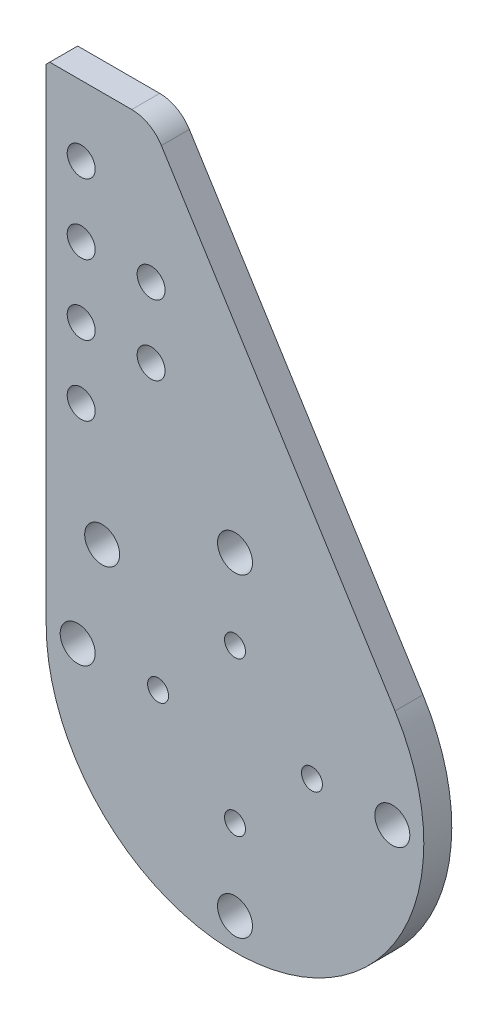
ISO-10303-21;
HEADER;
FILE_DESCRIPTION(('STEP AP214'),'2;1');
FILE_NAME('part.step','',(''),(''),'','','');
FILE_SCHEMA(('AUTOMOTIVE_DESIGN { 1 0 10303 214 1 1 1 1 }'));
ENDSEC;
DATA;
#1=APPLICATION_CONTEXT('core data for automotive mechanical design processes');
#2=APPLICATION_PROTOCOL_DEFINITION('international standard','automotive_design',2000,#1);
#3=PRODUCT_CONTEXT('',#1,'mechanical');
#4=PRODUCT('Part','Part','',(#3));
#5=PRODUCT_RELATED_PRODUCT_CATEGORY('part','',(#4));
#6=PRODUCT_DEFINITION_FORMATION('','',#4);
#7=PRODUCT_DEFINITION_CONTEXT('part definition',#1,'design');
#8=PRODUCT_DEFINITION('design','',#6,#7);
#9=PRODUCT_DEFINITION_SHAPE('','',#8);
#10=(LENGTH_UNIT() NAMED_UNIT(*) SI_UNIT(.MILLI.,.METRE.));
#11=(NAMED_UNIT(*) PLANE_ANGLE_UNIT() SI_UNIT($,.RADIAN.));
#12=(NAMED_UNIT(*) SI_UNIT($,.STERADIAN.) SOLID_ANGLE_UNIT());
#13=UNCERTAINTY_MEASURE_WITH_UNIT(LENGTH_MEASURE(1.E-05),#10,'distance_accuracy_value','');
#14=(GEOMETRIC_REPRESENTATION_CONTEXT(3) GLOBAL_UNCERTAINTY_ASSIGNED_CONTEXT((#13)) GLOBAL_UNIT_ASSIGNED_CONTEXT((#10,
#11,#12)) REPRESENTATION_CONTEXT('',''));
#15=CARTESIAN_POINT('',(0.,0.,0.));
#16=DIRECTION('',(0.,0.,1.));
#17=DIRECTION('',(1.,0.,0.));
#18=AXIS2_PLACEMENT_3D('',#15,#16,#17);
#19=CARTESIAN_POINT('',(0.,0.,4.));
#20=DIRECTION('',(0.,0.,1.));
#21=DIRECTION('',(1.,0.,0.));
#22=AXIS2_PLACEMENT_3D('',#19,#20,#21);
#23=PLANE('',#22);
#24=CARTESIAN_POINT('',(0.,-11.,4.));
#25=DIRECTION('',(0.,0.,1.));
#26=DIRECTION('',(1.,0.,0.));
#27=AXIS2_PLACEMENT_3D('',#24,#25,#26);
#28=CIRCLE('',#27,1.5);
#29=CARTESIAN_POINT('',(1.49999999999992,-11.,4.));
#30=VERTEX_POINT('',#29);
#31=EDGE_CURVE('E226',#30,#30,#28,.T.);
#32=ORIENTED_EDGE('',*,*,#31,.F.);
#33=EDGE_LOOP('',(#32));
#34=FACE_BOUND('',#33,.T.);
#35=CARTESIAN_POINT('',(-19.,14.,4.));
#36=DIRECTION('',(0.,0.,1.));
#37=DIRECTION('',(1.,0.,0.));
#38=AXIS2_PLACEMENT_3D('',#35,#36,#37);
#39=CIRCLE('',#38,2.5);
#40=CARTESIAN_POINT('',(-16.5,14.,4.));
#41=VERTEX_POINT('',#40);
#42=EDGE_CURVE('E214',#41,#41,#39,.T.);
#43=ORIENTED_EDGE('',*,*,#42,.F.);
#44=EDGE_LOOP('',(#43));
#45=FACE_BOUND('',#44,.T.);
#46=CARTESIAN_POINT('',(-12.,40.,4.));
#47=DIRECTION('',(0.,0.,1.));
#48=DIRECTION('',(1.,0.,0.));
#49=AXIS2_PLACEMENT_3D('',#46,#47,#48);
#50=CIRCLE('',#49,2.);
#51=CARTESIAN_POINT('',(-10.,40.,4.));
#52=VERTEX_POINT('',#51);
#53=EDGE_CURVE('E202',#52,#52,#50,.T.);
#54=ORIENTED_EDGE('',*,*,#53,.F.);
#55=EDGE_LOOP('',(#54));
#56=FACE_BOUND('',#55,.T.);
#57=CARTESIAN_POINT('',(-22.,40.,4.));
#58=DIRECTION('',(0.,0.,1.));
#59=DIRECTION('',(1.,0.,0.));
#60=AXIS2_PLACEMENT_3D('',#57,#58,#59);
#61=CIRCLE('',#60,2.00000000000001);
#62=CARTESIAN_POINT('',(-20.,40.,4.));
#63=VERTEX_POINT('',#62);
#64=EDGE_CURVE('E190',#63,#63,#61,.T.);
#65=ORIENTED_EDGE('',*,*,#64,.F.);
#66=EDGE_LOOP('',(#65));
#67=FACE_BOUND('',#66,.T.);
#68=CARTESIAN_POINT('',(-22.,50.,4.));
#69=DIRECTION('',(0.,0.,1.));
#70=DIRECTION('',(1.,0.,0.));
#71=AXIS2_PLACEMENT_3D('',#68,#69,#70);
#72=CIRCLE('',#71,2.);
#73=CARTESIAN_POINT('',(-20.,50.,4.));
#74=VERTEX_POINT('',#73);
#75=EDGE_CURVE('E178',#74,#74,#72,.T.);
#76=ORIENTED_EDGE('',*,*,#75,.F.);
#77=EDGE_LOOP('',(#76));
#78=FACE_BOUND('',#77,.T.);
#79=CARTESIAN_POINT('',(-22.4999999999993,-7.08552684711486E-13,4.));
#80=DIRECTION('',(0.,0.,1.));
#81=DIRECTION('',(1.,0.,0.));
#82=AXIS2_PLACEMENT_3D('',#79,#80,#81);
#83=CIRCLE('',#82,2.5);
#84=CARTESIAN_POINT('',(-19.9999999999993,-7.08552684711486E-13,4.));
#85=VERTEX_POINT('',#84);
#86=EDGE_CURVE('E166',#85,#85,#83,.T.);
#87=ORIENTED_EDGE('',*,*,#86,.F.);
#88=EDGE_LOOP('',(#87));
#89=FACE_BOUND('',#88,.T.);
#90=CARTESIAN_POINT('',(22.5000000000007,7.05797229413404E-13,4.));
#91=DIRECTION('',(0.,0.,1.));
#92=DIRECTION('',(1.,0.,0.));
#93=AXIS2_PLACEMENT_3D('',#90,#91,#92);
#94=CIRCLE('',#93,2.5);
#95=CARTESIAN_POINT('',(25.0000000000007,7.05797229413404E-13,4.));
#96=VERTEX_POINT('',#95);
#97=EDGE_CURVE('E154',#96,#96,#94,.T.);
#98=ORIENTED_EDGE('',*,*,#97,.F.);
#99=EDGE_LOOP('',(#98));
#100=FACE_BOUND('',#99,.T.);
#101=DIRECTION('',(-1.,0.,0.));
#102=VECTOR('',#101,1.);
#103=CARTESIAN_POINT('',(-27.,70.,4.));
#104=LINE('',#103,#102);
#105=CARTESIAN_POINT('',(-14.7674539749688,70.,4.));
#106=VERTEX_POINT('',#105);
#107=CARTESIAN_POINT('',(-26.5,70.,4.));
#108=VERTEX_POINT('',#107);
#109=EDGE_CURVE('E104',#106,#108,#104,.T.);
#110=ORIENTED_EDGE('',*,*,#109,.T.);
#111=DIRECTION('',(0.707106781186548,0.707106781186548,0.));
#112=VECTOR('',#111,1.);
#113=CARTESIAN_POINT('',(-48.25,48.25,4.));
#114=LINE('',#113,#112);
#115=CARTESIAN_POINT('',(-27.,69.5,4.));
#116=VERTEX_POINT('',#115);
#117=EDGE_CURVE('E11',#108,#116,#114,.F.);
#118=ORIENTED_EDGE('',*,*,#117,.T.);
#119=DIRECTION('',(0.,-1.,0.));
#120=VECTOR('',#119,1.);
#121=CARTESIAN_POINT('',(-27.,0.,4.));
#122=LINE('',#121,#120);
#123=CARTESIAN_POINT('',(-27.,0.,4.));
#124=VERTEX_POINT('',#123);
#125=EDGE_CURVE('E110',#116,#124,#122,.T.);
#126=ORIENTED_EDGE('',*,*,#125,.T.);
#127=CARTESIAN_POINT('',(0.,0.,4.));
#128=DIRECTION('',(0.,0.,1.));
#129=DIRECTION('',(1.,0.,0.));
#130=AXIS2_PLACEMENT_3D('',#127,#128,#129);
#131=CIRCLE('',#130,27.);
#132=CARTESIAN_POINT('',(22.8793753525154,14.3364634229893,4.));
#133=VERTEX_POINT('',#132);
#134=EDGE_CURVE('E105',#124,#133,#131,.T.);
#135=ORIENTED_EDGE('',*,*,#134,.T.);
#136=DIRECTION('',(-0.530980126777383,0.847384272315385,0.));
#137=VECTOR('',#136,1.);
#138=CARTESIAN_POINT('',(-11.9999971755815,70.,4.));
#139=LINE('',#138,#137);
#140=CARTESIAN_POINT('',(-10.5305326133919,67.6549006338869,4.));
#141=VERTEX_POINT('',#140);
#142=EDGE_CURVE('E93',#133,#141,#139,.T.);
#143=ORIENTED_EDGE('',*,*,#142,.T.);
#144=CARTESIAN_POINT('',(-14.7674539749688,65.,4.));
#145=DIRECTION('',(0.,0.,1.));
#146=DIRECTION('',(1.,0.,0.));
#147=AXIS2_PLACEMENT_3D('',#144,#145,#146);
#148=CIRCLE('',#147,5.);
#149=EDGE_CURVE('E130',#141,#106,#148,.T.);
#150=ORIENTED_EDGE('',*,*,#149,.T.);
#151=EDGE_LOOP('',(#110,#118,#126,#135,#143,#150));
#152=FACE_BOUND('',#151,.T.);
#153=CARTESIAN_POINT('',(0.,22.5,4.));
#154=DIRECTION('',(0.,0.,1.));
#155=DIRECTION('',(1.,0.,0.));
#156=AXIS2_PLACEMENT_3D('',#153,#154,#155);
#157=CIRCLE('',#156,2.5);
#158=CARTESIAN_POINT('',(2.5,22.5,4.));
#159=VERTEX_POINT('',#158);
#160=EDGE_CURVE('E148',#159,#159,#157,.T.);
#161=ORIENTED_EDGE('',*,*,#160,.F.);
#162=EDGE_LOOP('',(#161));
#163=FACE_BOUND('',#162,.T.);
#164=CARTESIAN_POINT('',(1.41159445882681E-12,-22.5,4.));
#165=DIRECTION('',(0.,0.,1.));
#166=DIRECTION('',(1.,0.,0.));
#167=AXIS2_PLACEMENT_3D('',#164,#165,#166);
#168=CIRCLE('',#167,2.5);
#169=CARTESIAN_POINT('',(2.50000000000141,-22.5,4.));
#170=VERTEX_POINT('',#169);
#171=EDGE_CURVE('E160',#170,#170,#168,.T.);
#172=ORIENTED_EDGE('',*,*,#171,.F.);
#173=EDGE_LOOP('',(#172));
#174=FACE_BOUND('',#173,.T.);
#175=CARTESIAN_POINT('',(-22.,60.,4.));
#176=DIRECTION('',(0.,0.,1.));
#177=DIRECTION('',(1.,0.,0.));
#178=AXIS2_PLACEMENT_3D('',#175,#176,#177);
#179=CIRCLE('',#178,2.);
#180=CARTESIAN_POINT('',(-20.,60.,4.));
#181=VERTEX_POINT('',#180);
#182=EDGE_CURVE('E172',#181,#181,#179,.T.);
#183=ORIENTED_EDGE('',*,*,#182,.F.);
#184=EDGE_LOOP('',(#183));
#185=FACE_BOUND('',#184,.T.);
#186=CARTESIAN_POINT('',(-22.,30.,4.));
#187=DIRECTION('',(0.,0.,1.));
#188=DIRECTION('',(1.,0.,0.));
#189=AXIS2_PLACEMENT_3D('',#186,#187,#188);
#190=CIRCLE('',#189,2.00000000000001);
#191=CARTESIAN_POINT('',(-20.,30.,4.));
#192=VERTEX_POINT('',#191);
#193=EDGE_CURVE('E184',#192,#192,#190,.T.);
#194=ORIENTED_EDGE('',*,*,#193,.F.);
#195=EDGE_LOOP('',(#194));
#196=FACE_BOUND('',#195,.T.);
#197=CARTESIAN_POINT('',(-12.,50.,4.));
#198=DIRECTION('',(0.,0.,1.));
#199=DIRECTION('',(1.,0.,0.));
#200=AXIS2_PLACEMENT_3D('',#197,#198,#199);
#201=CIRCLE('',#200,2.);
#202=CARTESIAN_POINT('',(-10.,50.,4.));
#203=VERTEX_POINT('',#202);
#204=EDGE_CURVE('E196',#203,#203,#201,.T.);
#205=ORIENTED_EDGE('',*,*,#204,.F.);
#206=EDGE_LOOP('',(#205));
#207=FACE_BOUND('',#206,.T.);
#208=CARTESIAN_POINT('',(0.,11.,4.));
#209=DIRECTION('',(0.,0.,1.));
#210=DIRECTION('',(1.,0.,0.));
#211=AXIS2_PLACEMENT_3D('',#208,#209,#210);
#212=CIRCLE('',#211,1.5);
#213=CARTESIAN_POINT('',(1.5,11.,4.));
#214=VERTEX_POINT('',#213);
#215=EDGE_CURVE('E208',#214,#214,#212,.T.);
#216=ORIENTED_EDGE('',*,*,#215,.F.);
#217=EDGE_LOOP('',(#216));
#218=FACE_BOUND('',#217,.T.);
#219=CARTESIAN_POINT('',(11.,0.,4.));
#220=DIRECTION('',(0.,0.,1.));
#221=DIRECTION('',(1.,0.,0.));
#222=AXIS2_PLACEMENT_3D('',#219,#220,#221);
#223=CIRCLE('',#222,1.5);
#224=CARTESIAN_POINT('',(12.5,0.,4.));
#225=VERTEX_POINT('',#224);
#226=EDGE_CURVE('E220',#225,#225,#223,.T.);
#227=ORIENTED_EDGE('',*,*,#226,.F.);
#228=EDGE_LOOP('',(#227));
#229=FACE_BOUND('',#228,.T.);
#230=CARTESIAN_POINT('',(-11.,1.15218884181823E-13,4.));
#231=DIRECTION('',(0.,0.,1.));
#232=DIRECTION('',(1.,0.,0.));
#233=AXIS2_PLACEMENT_3D('',#230,#231,#232);
#234=CIRCLE('',#233,1.5);
#235=CARTESIAN_POINT('',(-9.5,1.15218884181823E-13,4.));
#236=VERTEX_POINT('',#235);
#237=EDGE_CURVE('E232',#236,#236,#234,.T.);
#238=ORIENTED_EDGE('',*,*,#237,.F.);
#239=EDGE_LOOP('',(#238));
#240=FACE_BOUND('',#239,.T.);
#241=ADVANCED_FACE('F39',(#34,#45,#56,#67,#78,#89,#100,#152,#163,#174,#185,#196,#207,#218,#229,
#240),#23,.T.);
#242=CARTESIAN_POINT('',(0.,0.,0.));
#243=DIRECTION('',(0.,0.,1.));
#244=DIRECTION('',(1.,0.,0.));
#245=AXIS2_PLACEMENT_3D('',#242,#243,#244);
#246=PLANE('',#245);
#247=DIRECTION('',(0.,-1.,0.));
#248=VECTOR('',#247,1.);
#249=CARTESIAN_POINT('',(-27.,0.,0.));
#250=LINE('',#249,#248);
#251=CARTESIAN_POINT('',(-27.,69.5,0.));
#252=VERTEX_POINT('',#251);
#253=CARTESIAN_POINT('',(-27.,0.,0.));
#254=VERTEX_POINT('',#253);
#255=EDGE_CURVE('E114',#252,#254,#250,.T.);
#256=ORIENTED_EDGE('',*,*,#255,.F.);
#257=DIRECTION('',(-0.707106781186548,-0.707106781186548,0.));
#258=VECTOR('',#257,1.);
#259=CARTESIAN_POINT('',(-27.,69.5,0.));
#260=LINE('',#259,#258);
#261=CARTESIAN_POINT('',(-26.5,70.,0.));
#262=VERTEX_POINT('',#261);
#263=EDGE_CURVE('E62',#252,#262,#260,.F.);
#264=ORIENTED_EDGE('',*,*,#263,.T.);
#265=DIRECTION('',(-1.,0.,0.));
#266=VECTOR('',#265,1.);
#267=CARTESIAN_POINT('',(-27.,70.,0.));
#268=LINE('',#267,#266);
#269=CARTESIAN_POINT('',(-14.7674539749688,70.,0.));
#270=VERTEX_POINT('',#269);
#271=EDGE_CURVE('E142',#270,#262,#268,.T.);
#272=ORIENTED_EDGE('',*,*,#271,.F.);
#273=CARTESIAN_POINT('',(-14.7674539749688,65.,0.));
#274=DIRECTION('',(0.,0.,1.));
#275=DIRECTION('',(1.,0.,0.));
#276=AXIS2_PLACEMENT_3D('',#273,#274,#275);
#277=CIRCLE('',#276,5.);
#278=CARTESIAN_POINT('',(-10.5305326133919,67.6549006338869,0.));
#279=VERTEX_POINT('',#278);
#280=EDGE_CURVE('E123',#270,#279,#277,.F.);
#281=ORIENTED_EDGE('',*,*,#280,.T.);
#282=DIRECTION('',(-0.530980126777383,0.847384272315385,0.));
#283=VECTOR('',#282,1.);
#284=CARTESIAN_POINT('',(-11.9999971755815,70.,0.));
#285=LINE('',#284,#283);
#286=CARTESIAN_POINT('',(22.8793753525154,14.3364634229893,0.));
#287=VERTEX_POINT('',#286);
#288=EDGE_CURVE('E143',#287,#279,#285,.T.);
#289=ORIENTED_EDGE('',*,*,#288,.F.);
#290=CARTESIAN_POINT('',(0.,0.,0.));
#291=DIRECTION('',(0.,0.,1.));
#292=DIRECTION('',(1.,0.,0.));
#293=AXIS2_PLACEMENT_3D('',#290,#291,#292);
#294=CIRCLE('',#293,27.);
#295=EDGE_CURVE('E118',#254,#287,#294,.T.);
#296=ORIENTED_EDGE('',*,*,#295,.F.);
#297=EDGE_LOOP('',(#256,#264,#272,#281,#289,#296));
#298=FACE_BOUND('',#297,.T.);
#299=CARTESIAN_POINT('',(0.,22.5,0.));
#300=DIRECTION('',(0.,0.,1.));
#301=DIRECTION('',(1.,0.,0.));
#302=AXIS2_PLACEMENT_3D('',#299,#300,#301);
#303=CIRCLE('',#302,2.5);
#304=CARTESIAN_POINT('',(2.5,22.5,0.));
#305=VERTEX_POINT('',#304);
#306=EDGE_CURVE('E151',#305,#305,#303,.T.);
#307=ORIENTED_EDGE('',*,*,#306,.T.);
#308=EDGE_LOOP('',(#307));
#309=FACE_BOUND('',#308,.T.);
#310=CARTESIAN_POINT('',(22.5000000000007,7.05797229413404E-13,0.));
#311=DIRECTION('',(0.,0.,1.));
#312=DIRECTION('',(1.,0.,0.));
#313=AXIS2_PLACEMENT_3D('',#310,#311,#312);
#314=CIRCLE('',#313,2.5);
#315=CARTESIAN_POINT('',(25.0000000000007,7.05797229413404E-13,0.));
#316=VERTEX_POINT('',#315);
#317=EDGE_CURVE('E157',#316,#316,#314,.T.);
#318=ORIENTED_EDGE('',*,*,#317,.T.);
#319=EDGE_LOOP('',(#318));
#320=FACE_BOUND('',#319,.T.);
#321=CARTESIAN_POINT('',(1.41159445882681E-12,-22.5,0.));
#322=DIRECTION('',(0.,0.,1.));
#323=DIRECTION('',(1.,0.,0.));
#324=AXIS2_PLACEMENT_3D('',#321,#322,#323);
#325=CIRCLE('',#324,2.5);
#326=CARTESIAN_POINT('',(2.50000000000141,-22.5,0.));
#327=VERTEX_POINT('',#326);
#328=EDGE_CURVE('E163',#327,#327,#325,.T.);
#329=ORIENTED_EDGE('',*,*,#328,.T.);
#330=EDGE_LOOP('',(#329));
#331=FACE_BOUND('',#330,.T.);
#332=CARTESIAN_POINT('',(-22.4999999999993,-7.08552684711486E-13,0.));
#333=DIRECTION('',(0.,0.,1.));
#334=DIRECTION('',(1.,0.,0.));
#335=AXIS2_PLACEMENT_3D('',#332,#333,#334);
#336=CIRCLE('',#335,2.5);
#337=CARTESIAN_POINT('',(-19.9999999999993,-7.08552684711486E-13,0.));
#338=VERTEX_POINT('',#337);
#339=EDGE_CURVE('E169',#338,#338,#336,.T.);
#340=ORIENTED_EDGE('',*,*,#339,.T.);
#341=EDGE_LOOP('',(#340));
#342=FACE_BOUND('',#341,.T.);
#343=CARTESIAN_POINT('',(-22.,60.,0.));
#344=DIRECTION('',(0.,0.,1.));
#345=DIRECTION('',(1.,0.,0.));
#346=AXIS2_PLACEMENT_3D('',#343,#344,#345);
#347=CIRCLE('',#346,2.);
#348=CARTESIAN_POINT('',(-20.,60.,0.));
#349=VERTEX_POINT('',#348);
#350=EDGE_CURVE('E175',#349,#349,#347,.T.);
#351=ORIENTED_EDGE('',*,*,#350,.T.);
#352=EDGE_LOOP('',(#351));
#353=FACE_BOUND('',#352,.T.);
#354=CARTESIAN_POINT('',(-22.,50.,0.));
#355=DIRECTION('',(0.,0.,1.));
#356=DIRECTION('',(1.,0.,0.));
#357=AXIS2_PLACEMENT_3D('',#354,#355,#356);
#358=CIRCLE('',#357,2.);
#359=CARTESIAN_POINT('',(-20.,50.,0.));
#360=VERTEX_POINT('',#359);
#361=EDGE_CURVE('E181',#360,#360,#358,.T.);
#362=ORIENTED_EDGE('',*,*,#361,.T.);
#363=EDGE_LOOP('',(#362));
#364=FACE_BOUND('',#363,.T.);
#365=CARTESIAN_POINT('',(-22.,30.,0.));
#366=DIRECTION('',(0.,0.,1.));
#367=DIRECTION('',(1.,0.,0.));
#368=AXIS2_PLACEMENT_3D('',#365,#366,#367);
#369=CIRCLE('',#368,2.00000000000001);
#370=CARTESIAN_POINT('',(-20.,30.,0.));
#371=VERTEX_POINT('',#370);
#372=EDGE_CURVE('E187',#371,#371,#369,.T.);
#373=ORIENTED_EDGE('',*,*,#372,.T.);
#374=EDGE_LOOP('',(#373));
#375=FACE_BOUND('',#374,.T.);
#376=CARTESIAN_POINT('',(-22.,40.,0.));
#377=DIRECTION('',(0.,0.,1.));
#378=DIRECTION('',(1.,0.,0.));
#379=AXIS2_PLACEMENT_3D('',#376,#377,#378);
#380=CIRCLE('',#379,2.00000000000001);
#381=CARTESIAN_POINT('',(-20.,40.,0.));
#382=VERTEX_POINT('',#381);
#383=EDGE_CURVE('E193',#382,#382,#380,.T.);
#384=ORIENTED_EDGE('',*,*,#383,.T.);
#385=EDGE_LOOP('',(#384));
#386=FACE_BOUND('',#385,.T.);
#387=CARTESIAN_POINT('',(-12.,50.,0.));
#388=DIRECTION('',(0.,0.,1.));
#389=DIRECTION('',(1.,0.,0.));
#390=AXIS2_PLACEMENT_3D('',#387,#388,#389);
#391=CIRCLE('',#390,2.);
#392=CARTESIAN_POINT('',(-10.,50.,0.));
#393=VERTEX_POINT('',#392);
#394=EDGE_CURVE('E199',#393,#393,#391,.T.);
#395=ORIENTED_EDGE('',*,*,#394,.T.);
#396=EDGE_LOOP('',(#395));
#397=FACE_BOUND('',#396,.T.);
#398=CARTESIAN_POINT('',(-12.,40.,0.));
#399=DIRECTION('',(0.,0.,1.));
#400=DIRECTION('',(1.,0.,0.));
#401=AXIS2_PLACEMENT_3D('',#398,#399,#400);
#402=CIRCLE('',#401,2.);
#403=CARTESIAN_POINT('',(-10.,40.,0.));
#404=VERTEX_POINT('',#403);
#405=EDGE_CURVE('E205',#404,#404,#402,.T.);
#406=ORIENTED_EDGE('',*,*,#405,.T.);
#407=EDGE_LOOP('',(#406));
#408=FACE_BOUND('',#407,.T.);
#409=CARTESIAN_POINT('',(0.,11.,0.));
#410=DIRECTION('',(0.,0.,1.));
#411=DIRECTION('',(1.,0.,0.));
#412=AXIS2_PLACEMENT_3D('',#409,#410,#411);
#413=CIRCLE('',#412,1.5);
#414=CARTESIAN_POINT('',(1.5,11.,0.));
#415=VERTEX_POINT('',#414);
#416=EDGE_CURVE('E211',#415,#415,#413,.T.);
#417=ORIENTED_EDGE('',*,*,#416,.T.);
#418=EDGE_LOOP('',(#417));
#419=FACE_BOUND('',#418,.T.);
#420=CARTESIAN_POINT('',(-19.,14.,0.));
#421=DIRECTION('',(0.,0.,1.));
#422=DIRECTION('',(1.,0.,0.));
#423=AXIS2_PLACEMENT_3D('',#420,#421,#422);
#424=CIRCLE('',#423,2.5);
#425=CARTESIAN_POINT('',(-16.5,14.,0.));
#426=VERTEX_POINT('',#425);
#427=EDGE_CURVE('E217',#426,#426,#424,.T.);
#428=ORIENTED_EDGE('',*,*,#427,.T.);
#429=EDGE_LOOP('',(#428));
#430=FACE_BOUND('',#429,.T.);
#431=CARTESIAN_POINT('',(11.,0.,0.));
#432=DIRECTION('',(0.,0.,1.));
#433=DIRECTION('',(1.,0.,0.));
#434=AXIS2_PLACEMENT_3D('',#431,#432,#433);
#435=CIRCLE('',#434,1.5);
#436=CARTESIAN_POINT('',(12.5,0.,0.));
#437=VERTEX_POINT('',#436);
#438=EDGE_CURVE('E223',#437,#437,#435,.T.);
#439=ORIENTED_EDGE('',*,*,#438,.T.);
#440=EDGE_LOOP('',(#439));
#441=FACE_BOUND('',#440,.T.);
#442=CARTESIAN_POINT('',(0.,-11.,0.));
#443=DIRECTION('',(0.,0.,1.));
#444=DIRECTION('',(1.,0.,0.));
#445=AXIS2_PLACEMENT_3D('',#442,#443,#444);
#446=CIRCLE('',#445,1.5);
#447=CARTESIAN_POINT('',(1.49999999999992,-11.,0.));
#448=VERTEX_POINT('',#447);
#449=EDGE_CURVE('E229',#448,#448,#446,.T.);
#450=ORIENTED_EDGE('',*,*,#449,.T.);
#451=EDGE_LOOP('',(#450));
#452=FACE_BOUND('',#451,.T.);
#453=CARTESIAN_POINT('',(-11.,1.15218884181823E-13,0.));
#454=DIRECTION('',(0.,0.,1.));
#455=DIRECTION('',(1.,0.,0.));
#456=AXIS2_PLACEMENT_3D('',#453,#454,#455);
#457=CIRCLE('',#456,1.5);
#458=CARTESIAN_POINT('',(-9.5,1.15218884181823E-13,0.));
#459=VERTEX_POINT('',#458);
#460=EDGE_CURVE('E235',#459,#459,#457,.T.);
#461=ORIENTED_EDGE('',*,*,#460,.T.);
#462=EDGE_LOOP('',(#461));
#463=FACE_BOUND('',#462,.T.);
#464=ADVANCED_FACE('F140',(#298,#309,#320,#331,#342,#353,#364,#375,#386,#397,#408,#419,#430,
#441,#452,#463),#246,.F.);
#465=CARTESIAN_POINT('',(0.,0.,4.));
#466=DIRECTION('',(0.,0.,-1.));
#467=DIRECTION('',(-1.,0.,0.));
#468=AXIS2_PLACEMENT_3D('',#465,#466,#467);
#469=CYLINDRICAL_SURFACE('',#468,27.);
#470=ORIENTED_EDGE('',*,*,#295,.T.);
#471=DIRECTION('',(0.,0.,-1.));
#472=VECTOR('',#471,1.);
#473=CARTESIAN_POINT('',(22.8793753525154,14.3364634229893,4.));
#474=LINE('',#473,#472);
#475=EDGE_CURVE('E98',#133,#287,#474,.T.);
#476=ORIENTED_EDGE('',*,*,#475,.F.);
#477=ORIENTED_EDGE('',*,*,#134,.F.);
#478=DIRECTION('',(0.,0.,-1.));
#479=VECTOR('',#478,1.);
#480=CARTESIAN_POINT('',(-27.,0.,4.));
#481=LINE('',#480,#479);
#482=EDGE_CURVE('E120',#124,#254,#481,.T.);
#483=ORIENTED_EDGE('',*,*,#482,.T.);
#484=EDGE_LOOP('',(#470,#476,#477,#483));
#485=FACE_BOUND('',#484,.T.);
#486=ADVANCED_FACE('F116',(#485),#469,.T.);
#487=CARTESIAN_POINT('',(-11.9999971755815,70.,4.));
#488=DIRECTION('',(-0.847384272315385,-0.530980126777383,0.));
#489=DIRECTION('',(0.530980126777383,-0.847384272315385,0.));
#490=AXIS2_PLACEMENT_3D('',#487,#488,#489);
#491=PLANE('',#490);
#492=ORIENTED_EDGE('',*,*,#288,.T.);
#493=DIRECTION('',(0.,0.,-1.));
#494=VECTOR('',#493,1.);
#495=CARTESIAN_POINT('',(-10.5305326133919,67.6549006338869,4.));
#496=LINE('',#495,#494);
#497=EDGE_CURVE('E101',#279,#141,#496,.F.);
#498=ORIENTED_EDGE('',*,*,#497,.T.);
#499=ORIENTED_EDGE('',*,*,#142,.F.);
#500=ORIENTED_EDGE('',*,*,#475,.T.);
#501=EDGE_LOOP('',(#492,#498,#499,#500));
#502=FACE_BOUND('',#501,.T.);
#503=ADVANCED_FACE('F96',(#502),#491,.F.);
#504=CARTESIAN_POINT('',(-27.,70.,4.));
#505=DIRECTION('',(0.,-1.,0.));
#506=DIRECTION('',(0.,0.,-1.));
#507=AXIS2_PLACEMENT_3D('',#504,#505,#506);
#508=PLANE('',#507);
#509=ORIENTED_EDGE('',*,*,#271,.T.);
#510=DIRECTION('',(0.,0.,1.));
#511=VECTOR('',#510,1.);
#512=CARTESIAN_POINT('',(-26.5,70.,4.));
#513=LINE('',#512,#511);
#514=EDGE_CURVE('E48',#262,#108,#513,.T.);
#515=ORIENTED_EDGE('',*,*,#514,.T.);
#516=ORIENTED_EDGE('',*,*,#109,.F.);
#517=DIRECTION('',(0.,0.,-1.));
#518=VECTOR('',#517,1.);
#519=CARTESIAN_POINT('',(-14.7674539749688,70.,4.));
#520=LINE('',#519,#518);
#521=EDGE_CURVE('E119',#106,#270,#520,.T.);
#522=ORIENTED_EDGE('',*,*,#521,.T.);
#523=EDGE_LOOP('',(#509,#515,#516,#522));
#524=FACE_BOUND('',#523,.T.);
#525=ADVANCED_FACE('F259',(#524),#508,.F.);
#526=CARTESIAN_POINT('',(-27.,0.,4.));
#527=DIRECTION('',(1.,0.,0.));
#528=DIRECTION('',(0.,0.,-1.));
#529=AXIS2_PLACEMENT_3D('',#526,#527,#528);
#530=PLANE('',#529);
#531=ORIENTED_EDGE('',*,*,#125,.F.);
#532=DIRECTION('',(0.,0.,-1.));
#533=VECTOR('',#532,1.);
#534=CARTESIAN_POINT('',(-27.,69.5,4.));
#535=LINE('',#534,#533);
#536=EDGE_CURVE('E132',#116,#252,#535,.T.);
#537=ORIENTED_EDGE('',*,*,#536,.T.);
#538=ORIENTED_EDGE('',*,*,#255,.T.);
#539=ORIENTED_EDGE('',*,*,#482,.F.);
#540=EDGE_LOOP('',(#531,#537,#538,#539));
#541=FACE_BOUND('',#540,.T.);
#542=ADVANCED_FACE('F137',(#541),#530,.F.);
#543=CARTESIAN_POINT('',(0.,22.5,4.));
#544=DIRECTION('',(0.,0.,-1.));
#545=DIRECTION('',(-1.,0.,0.));
#546=AXIS2_PLACEMENT_3D('',#543,#544,#545);
#547=CYLINDRICAL_SURFACE('',#546,2.5);
#548=ORIENTED_EDGE('',*,*,#160,.T.);
#549=EDGE_LOOP('',(#548));
#550=FACE_BOUND('',#549,.T.);
#551=ORIENTED_EDGE('',*,*,#306,.F.);
#552=EDGE_LOOP('',(#551));
#553=FACE_BOUND('',#552,.T.);
#554=ADVANCED_FACE('F254',(#550,#553),#547,.F.);
#555=CARTESIAN_POINT('',(22.5000000000007,7.05797229413404E-13,4.));
#556=DIRECTION('',(0.,0.,-1.));
#557=DIRECTION('',(-1.,0.,0.));
#558=AXIS2_PLACEMENT_3D('',#555,#556,#557);
#559=CYLINDRICAL_SURFACE('',#558,2.5);
#560=ORIENTED_EDGE('',*,*,#97,.T.);
#561=EDGE_LOOP('',(#560));
#562=FACE_BOUND('',#561,.T.);
#563=ORIENTED_EDGE('',*,*,#317,.F.);
#564=EDGE_LOOP('',(#563));
#565=FACE_BOUND('',#564,.T.);
#566=ADVANCED_FACE('F323',(#562,#565),#559,.F.);
#567=CARTESIAN_POINT('',(1.41159445882681E-12,-22.5,4.));
#568=DIRECTION('',(0.,0.,-1.));
#569=DIRECTION('',(-1.,0.,0.));
#570=AXIS2_PLACEMENT_3D('',#567,#568,#569);
#571=CYLINDRICAL_SURFACE('',#570,2.5);
#572=ORIENTED_EDGE('',*,*,#171,.T.);
#573=EDGE_LOOP('',(#572));
#574=FACE_BOUND('',#573,.T.);
#575=ORIENTED_EDGE('',*,*,#328,.F.);
#576=EDGE_LOOP('',(#575));
#577=FACE_BOUND('',#576,.T.);
#578=ADVANCED_FACE('F320',(#574,#577),#571,.F.);
#579=CARTESIAN_POINT('',(-22.4999999999993,-7.08552684711486E-13,4.));
#580=DIRECTION('',(0.,0.,-1.));
#581=DIRECTION('',(-1.,0.,0.));
#582=AXIS2_PLACEMENT_3D('',#579,#580,#581);
#583=CYLINDRICAL_SURFACE('',#582,2.5);
#584=ORIENTED_EDGE('',*,*,#86,.T.);
#585=EDGE_LOOP('',(#584));
#586=FACE_BOUND('',#585,.T.);
#587=ORIENTED_EDGE('',*,*,#339,.F.);
#588=EDGE_LOOP('',(#587));
#589=FACE_BOUND('',#588,.T.);
#590=ADVANCED_FACE('F316',(#586,#589),#583,.F.);
#591=CARTESIAN_POINT('',(-22.,60.,4.));
#592=DIRECTION('',(0.,0.,-1.));
#593=DIRECTION('',(-1.,0.,0.));
#594=AXIS2_PLACEMENT_3D('',#591,#592,#593);
#595=CYLINDRICAL_SURFACE('',#594,2.);
#596=ORIENTED_EDGE('',*,*,#182,.T.);
#597=EDGE_LOOP('',(#596));
#598=FACE_BOUND('',#597,.T.);
#599=ORIENTED_EDGE('',*,*,#350,.F.);
#600=EDGE_LOOP('',(#599));
#601=FACE_BOUND('',#600,.T.);
#602=ADVANCED_FACE('F312',(#598,#601),#595,.F.);
#603=CARTESIAN_POINT('',(-22.,50.,4.));
#604=DIRECTION('',(0.,0.,-1.));
#605=DIRECTION('',(-1.,0.,0.));
#606=AXIS2_PLACEMENT_3D('',#603,#604,#605);
#607=CYLINDRICAL_SURFACE('',#606,2.);
#608=ORIENTED_EDGE('',*,*,#75,.T.);
#609=EDGE_LOOP('',(#608));
#610=FACE_BOUND('',#609,.T.);
#611=ORIENTED_EDGE('',*,*,#361,.F.);
#612=EDGE_LOOP('',(#611));
#613=FACE_BOUND('',#612,.T.);
#614=ADVANCED_FACE('F308',(#610,#613),#607,.F.);
#615=CARTESIAN_POINT('',(-22.,30.,4.));
#616=DIRECTION('',(0.,0.,-1.));
#617=DIRECTION('',(-1.,0.,0.));
#618=AXIS2_PLACEMENT_3D('',#615,#616,#617);
#619=CYLINDRICAL_SURFACE('',#618,2.00000000000001);
#620=ORIENTED_EDGE('',*,*,#193,.T.);
#621=EDGE_LOOP('',(#620));
#622=FACE_BOUND('',#621,.T.);
#623=ORIENTED_EDGE('',*,*,#372,.F.);
#624=EDGE_LOOP('',(#623));
#625=FACE_BOUND('',#624,.T.);
#626=ADVANCED_FACE('F304',(#622,#625),#619,.F.);
#627=CARTESIAN_POINT('',(-22.,40.,4.));
#628=DIRECTION('',(0.,0.,-1.));
#629=DIRECTION('',(-1.,0.,0.));
#630=AXIS2_PLACEMENT_3D('',#627,#628,#629);
#631=CYLINDRICAL_SURFACE('',#630,2.00000000000001);
#632=ORIENTED_EDGE('',*,*,#64,.T.);
#633=EDGE_LOOP('',(#632));
#634=FACE_BOUND('',#633,.T.);
#635=ORIENTED_EDGE('',*,*,#383,.F.);
#636=EDGE_LOOP('',(#635));
#637=FACE_BOUND('',#636,.T.);
#638=ADVANCED_FACE('F300',(#634,#637),#631,.F.);
#639=CARTESIAN_POINT('',(-12.,50.,4.));
#640=DIRECTION('',(0.,0.,-1.));
#641=DIRECTION('',(-1.,0.,0.));
#642=AXIS2_PLACEMENT_3D('',#639,#640,#641);
#643=CYLINDRICAL_SURFACE('',#642,2.);
#644=ORIENTED_EDGE('',*,*,#204,.T.);
#645=EDGE_LOOP('',(#644));
#646=FACE_BOUND('',#645,.T.);
#647=ORIENTED_EDGE('',*,*,#394,.F.);
#648=EDGE_LOOP('',(#647));
#649=FACE_BOUND('',#648,.T.);
#650=ADVANCED_FACE('F296',(#646,#649),#643,.F.);
#651=CARTESIAN_POINT('',(-12.,40.,4.));
#652=DIRECTION('',(0.,0.,-1.));
#653=DIRECTION('',(-1.,0.,0.));
#654=AXIS2_PLACEMENT_3D('',#651,#652,#653);
#655=CYLINDRICAL_SURFACE('',#654,2.);
#656=ORIENTED_EDGE('',*,*,#53,.T.);
#657=EDGE_LOOP('',(#656));
#658=FACE_BOUND('',#657,.T.);
#659=ORIENTED_EDGE('',*,*,#405,.F.);
#660=EDGE_LOOP('',(#659));
#661=FACE_BOUND('',#660,.T.);
#662=ADVANCED_FACE('F292',(#658,#661),#655,.F.);
#663=CARTESIAN_POINT('',(0.,11.,4.));
#664=DIRECTION('',(0.,0.,-1.));
#665=DIRECTION('',(-1.,0.,0.));
#666=AXIS2_PLACEMENT_3D('',#663,#664,#665);
#667=CYLINDRICAL_SURFACE('',#666,1.5);
#668=ORIENTED_EDGE('',*,*,#215,.T.);
#669=EDGE_LOOP('',(#668));
#670=FACE_BOUND('',#669,.T.);
#671=ORIENTED_EDGE('',*,*,#416,.F.);
#672=EDGE_LOOP('',(#671));
#673=FACE_BOUND('',#672,.T.);
#674=ADVANCED_FACE('F288',(#670,#673),#667,.F.);
#675=CARTESIAN_POINT('',(-19.,14.,4.));
#676=DIRECTION('',(0.,0.,-1.));
#677=DIRECTION('',(-1.,0.,0.));
#678=AXIS2_PLACEMENT_3D('',#675,#676,#677);
#679=CYLINDRICAL_SURFACE('',#678,2.5);
#680=ORIENTED_EDGE('',*,*,#42,.T.);
#681=EDGE_LOOP('',(#680));
#682=FACE_BOUND('',#681,.T.);
#683=ORIENTED_EDGE('',*,*,#427,.F.);
#684=EDGE_LOOP('',(#683));
#685=FACE_BOUND('',#684,.T.);
#686=ADVANCED_FACE('F284',(#682,#685),#679,.F.);
#687=CARTESIAN_POINT('',(11.,0.,4.));
#688=DIRECTION('',(0.,0.,-1.));
#689=DIRECTION('',(-1.,0.,0.));
#690=AXIS2_PLACEMENT_3D('',#687,#688,#689);
#691=CYLINDRICAL_SURFACE('',#690,1.5);
#692=ORIENTED_EDGE('',*,*,#226,.T.);
#693=EDGE_LOOP('',(#692));
#694=FACE_BOUND('',#693,.T.);
#695=ORIENTED_EDGE('',*,*,#438,.F.);
#696=EDGE_LOOP('',(#695));
#697=FACE_BOUND('',#696,.T.);
#698=ADVANCED_FACE('F278',(#694,#697),#691,.F.);
#699=CARTESIAN_POINT('',(0.,-11.,4.));
#700=DIRECTION('',(0.,0.,-1.));
#701=DIRECTION('',(-1.,0.,0.));
#702=AXIS2_PLACEMENT_3D('',#699,#700,#701);
#703=CYLINDRICAL_SURFACE('',#702,1.5);
#704=ORIENTED_EDGE('',*,*,#31,.T.);
#705=EDGE_LOOP('',(#704));
#706=FACE_BOUND('',#705,.T.);
#707=ORIENTED_EDGE('',*,*,#449,.F.);
#708=EDGE_LOOP('',(#707));
#709=FACE_BOUND('',#708,.T.);
#710=ADVANCED_FACE('F272',(#706,#709),#703,.F.);
#711=CARTESIAN_POINT('',(-11.,1.15218884181823E-13,4.));
#712=DIRECTION('',(0.,0.,-1.));
#713=DIRECTION('',(-1.,0.,0.));
#714=AXIS2_PLACEMENT_3D('',#711,#712,#713);
#715=CYLINDRICAL_SURFACE('',#714,1.5);
#716=ORIENTED_EDGE('',*,*,#237,.T.);
#717=EDGE_LOOP('',(#716));
#718=FACE_BOUND('',#717,.T.);
#719=ORIENTED_EDGE('',*,*,#460,.F.);
#720=EDGE_LOOP('',(#719));
#721=FACE_BOUND('',#720,.T.);
#722=ADVANCED_FACE('F241',(#718,#721),#715,.F.);
#723=CARTESIAN_POINT('',(-14.7674539749688,65.,4.));
#724=DIRECTION('',(0.,0.,-1.));
#725=DIRECTION('',(-1.,0.,0.));
#726=AXIS2_PLACEMENT_3D('',#723,#724,#725);
#727=CYLINDRICAL_SURFACE('',#726,5.);
#728=ORIENTED_EDGE('',*,*,#149,.F.);
#729=ORIENTED_EDGE('',*,*,#497,.F.);
#730=ORIENTED_EDGE('',*,*,#280,.F.);
#731=ORIENTED_EDGE('',*,*,#521,.F.);
#732=EDGE_LOOP('',(#728,#729,#730,#731));
#733=FACE_BOUND('',#732,.T.);
#734=ADVANCED_FACE('F265',(#733),#727,.T.);
#735=CARTESIAN_POINT('',(-27.,69.5,4.));
#736=DIRECTION('',(0.707106781186547,-0.707106781186547,0.));
#737=DIRECTION('',(0.,0.,-1.));
#738=AXIS2_PLACEMENT_3D('',#735,#736,#737);
#739=PLANE('',#738);
#740=ORIENTED_EDGE('',*,*,#117,.F.);
#741=ORIENTED_EDGE('',*,*,#514,.F.);
#742=ORIENTED_EDGE('',*,*,#263,.F.);
#743=ORIENTED_EDGE('',*,*,#536,.F.);
#744=EDGE_LOOP('',(#740,#741,#742,#743));
#745=FACE_BOUND('',#744,.T.);
#746=ADVANCED_FACE('F42',(#745),#739,.F.);
#747=CLOSED_SHELL('',(#241,#464,#486,#503,#525,#542,#554,#566,#578,#590,#602,#614,#626,#638,
#650,#662,#674,#686,#698,#710,#722,#734,#746));
#748=MANIFOLD_SOLID_BREP('B2',#747);
#749=ADVANCED_BREP_SHAPE_REPRESENTATION('',(#18,#748),#14);
#750=SHAPE_DEFINITION_REPRESENTATION(#9,#749);
ENDSEC;
END-ISO-10303-21;
